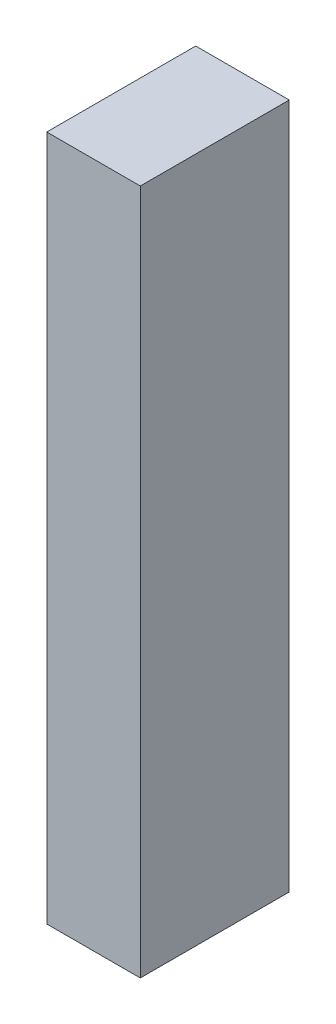
ISO-10303-21;
HEADER;
FILE_DESCRIPTION(('STEP AP214'),'2;1');
FILE_NAME('part.step','',(''),(''),'','','');
FILE_SCHEMA(('AUTOMOTIVE_DESIGN { 1 0 10303 214 1 1 1 1 }'));
ENDSEC;
DATA;
#1=APPLICATION_CONTEXT('core data for automotive mechanical design processes');
#2=APPLICATION_PROTOCOL_DEFINITION('international standard','automotive_design',2000,#1);
#3=PRODUCT_CONTEXT('',#1,'mechanical');
#4=PRODUCT('Part','Part','',(#3));
#5=PRODUCT_RELATED_PRODUCT_CATEGORY('part','',(#4));
#6=PRODUCT_DEFINITION_FORMATION('','',#4);
#7=PRODUCT_DEFINITION_CONTEXT('part definition',#1,'design');
#8=PRODUCT_DEFINITION('design','',#6,#7);
#9=PRODUCT_DEFINITION_SHAPE('','',#8);
#10=(LENGTH_UNIT() NAMED_UNIT(*) SI_UNIT(.MILLI.,.METRE.));
#11=(NAMED_UNIT(*) PLANE_ANGLE_UNIT() SI_UNIT($,.RADIAN.));
#12=(NAMED_UNIT(*) SI_UNIT($,.STERADIAN.) SOLID_ANGLE_UNIT());
#13=UNCERTAINTY_MEASURE_WITH_UNIT(LENGTH_MEASURE(1.E-05),#10,'distance_accuracy_value','');
#14=(GEOMETRIC_REPRESENTATION_CONTEXT(3) GLOBAL_UNCERTAINTY_ASSIGNED_CONTEXT((#13)) GLOBAL_UNIT_ASSIGNED_CONTEXT((#10,
#11,#12)) REPRESENTATION_CONTEXT('',''));
#15=CARTESIAN_POINT('',(0.,0.,0.));
#16=DIRECTION('',(0.,0.,1.));
#17=DIRECTION('',(1.,0.,0.));
#18=AXIS2_PLACEMENT_3D('',#15,#16,#17);
#19=CARTESIAN_POINT('',(0.67499992,-4.95000026,0.));
#20=DIRECTION('',(-1.,0.,0.));
#21=DIRECTION('',(0.,1.,0.));
#22=AXIS2_PLACEMENT_3D('',#19,#20,#21);
#23=PLANE('',#22);
#24=DIRECTION('',(0.,1.,0.));
#25=VECTOR('',#24,1.);
#26=CARTESIAN_POINT('',(0.67499992,-4.95000026,0.));
#27=LINE('',#26,#25);
#28=CARTESIAN_POINT('',(0.67499992,-4.95000026,0.));
#29=VERTEX_POINT('',#28);
#30=CARTESIAN_POINT('',(0.67499992,4.95000026,0.));
#31=VERTEX_POINT('',#30);
#32=EDGE_CURVE('E11',#29,#31,#27,.T.);
#33=ORIENTED_EDGE('',*,*,#32,.T.);
#34=DIRECTION('',(0.,0.,1.));
#35=VECTOR('',#34,1.);
#36=CARTESIAN_POINT('',(0.67499992,4.95000026,0.));
#37=LINE('',#36,#35);
#38=CARTESIAN_POINT('',(0.67499992,4.95000026,2.14999824));
#39=VERTEX_POINT('',#38);
#40=EDGE_CURVE('E24',#31,#39,#37,.T.);
#41=ORIENTED_EDGE('',*,*,#40,.T.);
#42=DIRECTION('',(0.,1.,0.));
#43=VECTOR('',#42,1.);
#44=CARTESIAN_POINT('',(0.67499992,-4.95000026,2.14999824));
#45=LINE('',#44,#43);
#46=CARTESIAN_POINT('',(0.67499992,-4.95000026,2.14999824));
#47=VERTEX_POINT('',#46);
#48=EDGE_CURVE('E87',#47,#39,#45,.T.);
#49=ORIENTED_EDGE('',*,*,#48,.F.);
#50=DIRECTION('',(0.,0.,1.));
#51=VECTOR('',#50,1.);
#52=CARTESIAN_POINT('',(0.67499992,-4.95000026,0.));
#53=LINE('',#52,#51);
#54=EDGE_CURVE('E36',#29,#47,#53,.T.);
#55=ORIENTED_EDGE('',*,*,#54,.F.);
#56=EDGE_LOOP('',(#33,#41,#49,#55));
#57=FACE_BOUND('',#56,.T.);
#58=ADVANCED_FACE('F17',(#57),#23,.F.);
#59=CARTESIAN_POINT('',(0.67499992,4.95000026,0.));
#60=DIRECTION('',(0.,-1.,0.));
#61=DIRECTION('',(-1.,0.,0.));
#62=AXIS2_PLACEMENT_3D('',#59,#60,#61);
#63=PLANE('',#62);
#64=DIRECTION('',(-1.,0.,0.));
#65=VECTOR('',#64,1.);
#66=CARTESIAN_POINT('',(0.67499992,4.95000026,0.));
#67=LINE('',#66,#65);
#68=CARTESIAN_POINT('',(-0.67499992,4.95000026,0.));
#69=VERTEX_POINT('',#68);
#70=EDGE_CURVE('E84',#31,#69,#67,.T.);
#71=ORIENTED_EDGE('',*,*,#70,.T.);
#72=DIRECTION('',(0.,0.,1.));
#73=VECTOR('',#72,1.);
#74=CARTESIAN_POINT('',(-0.67499992,4.95000026,0.));
#75=LINE('',#74,#73);
#76=CARTESIAN_POINT('',(-0.67499992,4.95000026,2.14999824));
#77=VERTEX_POINT('',#76);
#78=EDGE_CURVE('E82',#69,#77,#75,.T.);
#79=ORIENTED_EDGE('',*,*,#78,.T.);
#80=DIRECTION('',(-1.,0.,0.));
#81=VECTOR('',#80,1.);
#82=CARTESIAN_POINT('',(0.67499992,4.95000026,2.14999824));
#83=LINE('',#82,#81);
#84=EDGE_CURVE('E62',#39,#77,#83,.T.);
#85=ORIENTED_EDGE('',*,*,#84,.F.);
#86=ORIENTED_EDGE('',*,*,#40,.F.);
#87=EDGE_LOOP('',(#71,#79,#85,#86));
#88=FACE_BOUND('',#87,.T.);
#89=ADVANCED_FACE('F89',(#88),#63,.F.);
#90=CARTESIAN_POINT('',(-0.67499992,4.95000026,0.));
#91=DIRECTION('',(1.,0.,0.));
#92=DIRECTION('',(0.,-1.,0.));
#93=AXIS2_PLACEMENT_3D('',#90,#91,#92);
#94=PLANE('',#93);
#95=DIRECTION('',(0.,-1.,0.));
#96=VECTOR('',#95,1.);
#97=CARTESIAN_POINT('',(-0.67499992,4.95000026,0.));
#98=LINE('',#97,#96);
#99=CARTESIAN_POINT('',(-0.67499992,-4.95000026,0.));
#100=VERTEX_POINT('',#99);
#101=EDGE_CURVE('E71',#69,#100,#98,.T.);
#102=ORIENTED_EDGE('',*,*,#101,.T.);
#103=DIRECTION('',(0.,0.,1.));
#104=VECTOR('',#103,1.);
#105=CARTESIAN_POINT('',(-0.67499992,-4.95000026,0.));
#106=LINE('',#105,#104);
#107=CARTESIAN_POINT('',(-0.67499992,-4.95000026,2.14999824));
#108=VERTEX_POINT('',#107);
#109=EDGE_CURVE('E65',#100,#108,#106,.T.);
#110=ORIENTED_EDGE('',*,*,#109,.T.);
#111=DIRECTION('',(0.,-1.,0.));
#112=VECTOR('',#111,1.);
#113=CARTESIAN_POINT('',(-0.67499992,4.95000026,2.14999824));
#114=LINE('',#113,#112);
#115=EDGE_CURVE('E57',#77,#108,#114,.T.);
#116=ORIENTED_EDGE('',*,*,#115,.F.);
#117=ORIENTED_EDGE('',*,*,#78,.F.);
#118=EDGE_LOOP('',(#102,#110,#116,#117));
#119=FACE_BOUND('',#118,.T.);
#120=ADVANCED_FACE('F69',(#119),#94,.F.);
#121=CARTESIAN_POINT('',(-0.67499992,-4.95000026,0.));
#122=DIRECTION('',(0.,1.,0.));
#123=DIRECTION('',(1.,0.,0.));
#124=AXIS2_PLACEMENT_3D('',#121,#122,#123);
#125=PLANE('',#124);
#126=DIRECTION('',(1.,0.,0.));
#127=VECTOR('',#126,1.);
#128=CARTESIAN_POINT('',(-0.67499992,-4.95000026,0.));
#129=LINE('',#128,#127);
#130=EDGE_CURVE('E66',#100,#29,#129,.T.);
#131=ORIENTED_EDGE('',*,*,#130,.T.);
#132=ORIENTED_EDGE('',*,*,#54,.T.);
#133=DIRECTION('',(1.,0.,0.));
#134=VECTOR('',#133,1.);
#135=CARTESIAN_POINT('',(-0.67499992,-4.95000026,2.14999824));
#136=LINE('',#135,#134);
#137=EDGE_CURVE('E61',#108,#47,#136,.T.);
#138=ORIENTED_EDGE('',*,*,#137,.F.);
#139=ORIENTED_EDGE('',*,*,#109,.F.);
#140=EDGE_LOOP('',(#131,#132,#138,#139));
#141=FACE_BOUND('',#140,.T.);
#142=ADVANCED_FACE('F76',(#141),#125,.F.);
#143=CARTESIAN_POINT('',(0.,0.,0.));
#144=DIRECTION('',(0.,0.,1.));
#145=DIRECTION('',(1.,0.,0.));
#146=AXIS2_PLACEMENT_3D('',#143,#144,#145);
#147=PLANE('',#146);
#148=ORIENTED_EDGE('',*,*,#130,.F.);
#149=ORIENTED_EDGE('',*,*,#101,.F.);
#150=ORIENTED_EDGE('',*,*,#70,.F.);
#151=ORIENTED_EDGE('',*,*,#32,.F.);
#152=EDGE_LOOP('',(#148,#149,#150,#151));
#153=FACE_BOUND('',#152,.T.);
#154=ADVANCED_FACE('F91',(#153),#147,.F.);
#155=CARTESIAN_POINT('',(0.,0.,2.14999824));
#156=DIRECTION('',(0.,0.,1.));
#157=DIRECTION('',(1.,0.,0.));
#158=AXIS2_PLACEMENT_3D('',#155,#156,#157);
#159=PLANE('',#158);
#160=ORIENTED_EDGE('',*,*,#48,.T.);
#161=ORIENTED_EDGE('',*,*,#84,.T.);
#162=ORIENTED_EDGE('',*,*,#115,.T.);
#163=ORIENTED_EDGE('',*,*,#137,.T.);
#164=EDGE_LOOP('',(#160,#161,#162,#163));
#165=FACE_BOUND('',#164,.T.);
#166=ADVANCED_FACE('F59',(#165),#159,.T.);
#167=CLOSED_SHELL('',(#58,#89,#120,#142,#154,#166));
#168=MANIFOLD_SOLID_BREP('B1',#167);
#169=ADVANCED_BREP_SHAPE_REPRESENTATION('',(#18,#168),#14);
#170=SHAPE_DEFINITION_REPRESENTATION(#9,#169);
ENDSEC;
END-ISO-10303-21;
